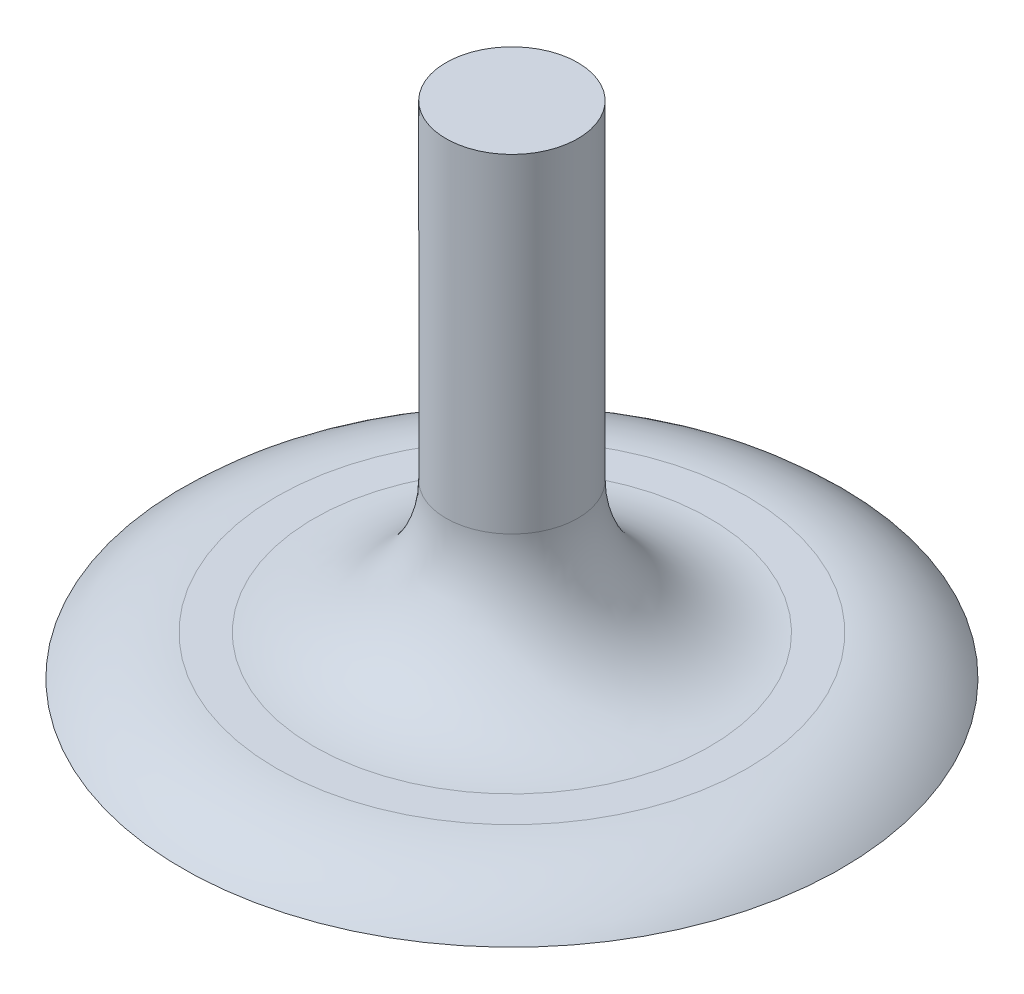
ISO-10303-21;
HEADER;
FILE_DESCRIPTION(('STEP AP214'),'2;1');
FILE_NAME('part.step','',(''),(''),'','','');
FILE_SCHEMA(('AUTOMOTIVE_DESIGN { 1 0 10303 214 1 1 1 1 }'));
ENDSEC;
DATA;
#1=APPLICATION_CONTEXT('core data for automotive mechanical design processes');
#2=APPLICATION_PROTOCOL_DEFINITION('international standard','automotive_design',2000,#1);
#3=PRODUCT_CONTEXT('',#1,'mechanical');
#4=PRODUCT('Part','Part','',(#3));
#5=PRODUCT_RELATED_PRODUCT_CATEGORY('part','',(#4));
#6=PRODUCT_DEFINITION_FORMATION('','',#4);
#7=PRODUCT_DEFINITION_CONTEXT('part definition',#1,'design');
#8=PRODUCT_DEFINITION('design','',#6,#7);
#9=PRODUCT_DEFINITION_SHAPE('','',#8);
#10=(LENGTH_UNIT() NAMED_UNIT(*) SI_UNIT(.MILLI.,.METRE.));
#11=(NAMED_UNIT(*) PLANE_ANGLE_UNIT() SI_UNIT($,.RADIAN.));
#12=(NAMED_UNIT(*) SI_UNIT($,.STERADIAN.) SOLID_ANGLE_UNIT());
#13=UNCERTAINTY_MEASURE_WITH_UNIT(LENGTH_MEASURE(1.E-05),#10,'distance_accuracy_value','');
#14=(GEOMETRIC_REPRESENTATION_CONTEXT(3) GLOBAL_UNCERTAINTY_ASSIGNED_CONTEXT((#13)) GLOBAL_UNIT_ASSIGNED_CONTEXT((#10,
#11,#12)) REPRESENTATION_CONTEXT('',''));
#15=CARTESIAN_POINT('',(0.,0.,0.));
#16=DIRECTION('',(0.,0.,1.));
#17=DIRECTION('',(1.,0.,0.));
#18=AXIS2_PLACEMENT_3D('',#15,#16,#17);
#19=CARTESIAN_POINT('',(0.,51.6594567321813,0.));
#20=DIRECTION('',(0.,1.,0.));
#21=DIRECTION('',(0.,0.,1.));
#22=AXIS2_PLACEMENT_3D('',#19,#20,#21);
#23=PLANE('',#22);
#24=CARTESIAN_POINT('',(0.,51.6594567321813,0.));
#25=DIRECTION('',(0.,-1.,0.));
#26=DIRECTION('',(0.,0.,-1.));
#27=AXIS2_PLACEMENT_3D('',#24,#25,#26);
#28=CIRCLE('',#27,5.);
#29=CARTESIAN_POINT('',(0.,51.6594567321813,-5.));
#30=VERTEX_POINT('',#29);
#31=EDGE_CURVE('E89',#30,#30,#28,.T.);
#32=ORIENTED_EDGE('',*,*,#31,.F.);
#33=EDGE_LOOP('',(#32));
#34=FACE_BOUND('',#33,.T.);
#35=ADVANCED_FACE('F35',(#34),#23,.T.);
#36=CARTESIAN_POINT('',(0.,0.,0.));
#37=DIRECTION('',(0.,-1.,0.));
#38=DIRECTION('',(0.,0.,-1.));
#39=AXIS2_PLACEMENT_3D('',#36,#37,#38);
#40=CYLINDRICAL_SURFACE('',#39,5.);
#41=CARTESIAN_POINT('',(0.,26.7225346025478,0.));
#42=DIRECTION('',(0.,1.,0.));
#43=DIRECTION('',(0.,0.,1.));
#44=AXIS2_PLACEMENT_3D('',#41,#42,#43);
#45=CIRCLE('',#44,5.);
#46=CARTESIAN_POINT('',(0.,26.7225346025478,5.));
#47=VERTEX_POINT('',#46);
#48=EDGE_CURVE('E42',#47,#47,#45,.T.);
#49=ORIENTED_EDGE('',*,*,#48,.T.);
#50=EDGE_LOOP('',(#49));
#51=FACE_BOUND('',#50,.T.);
#52=ORIENTED_EDGE('',*,*,#31,.T.);
#53=EDGE_LOOP('',(#52));
#54=FACE_BOUND('',#53,.T.);
#55=ADVANCED_FACE('F63',(#51,#54),#40,.T.);
#56=CARTESIAN_POINT('',(0.,16.7225346025478,-5.));
#57=DIRECTION('',(0.,1.,0.));
#58=DIRECTION('',(0.,0.,1.));
#59=AXIS2_PLACEMENT_3D('',#56,#57,#58);
#60=PLANE('',#59);
#61=CARTESIAN_POINT('',(0.,16.7225346025478,0.));
#62=DIRECTION('',(0.,1.,0.));
#63=DIRECTION('',(0.,0.,1.));
#64=AXIS2_PLACEMENT_3D('',#61,#62,#63);
#65=CIRCLE('',#64,17.8585715714571);
#66=CARTESIAN_POINT('',(0.,16.7225346025478,17.8585715714571));
#67=VERTEX_POINT('',#66);
#68=EDGE_CURVE('E11',#67,#67,#65,.T.);
#69=ORIENTED_EDGE('',*,*,#68,.T.);
#70=EDGE_LOOP('',(#69));
#71=FACE_BOUND('',#70,.T.);
#72=CARTESIAN_POINT('',(0.,16.7225346025478,0.));
#73=DIRECTION('',(0.,1.,0.));
#74=DIRECTION('',(0.,0.,1.));
#75=AXIS2_PLACEMENT_3D('',#72,#73,#74);
#76=CIRCLE('',#75,15.);
#77=CARTESIAN_POINT('',(0.,16.7225346025478,15.));
#78=VERTEX_POINT('',#77);
#79=EDGE_CURVE('E84',#78,#78,#76,.F.);
#80=ORIENTED_EDGE('',*,*,#79,.T.);
#81=EDGE_LOOP('',(#80));
#82=FACE_BOUND('',#81,.T.);
#83=ADVANCED_FACE('F58',(#71,#82),#60,.T.);
#84=CARTESIAN_POINT('',(0.,13.7225346025478,-25.));
#85=DIRECTION('',(0.,-1.,0.));
#86=DIRECTION('',(0.,0.,-1.));
#87=AXIS2_PLACEMENT_3D('',#84,#85,#86);
#88=PLANE('',#87);
#89=CARTESIAN_POINT('',(0.,13.7225346025478,0.));
#90=DIRECTION('',(0.,-1.,0.));
#91=DIRECTION('',(0.,0.,-1.));
#92=AXIS2_PLACEMENT_3D('',#89,#90,#91);
#93=CIRCLE('',#92,16.8743420870379);
#94=CARTESIAN_POINT('',(0.,13.7225346025478,-16.8743420870379));
#95=VERTEX_POINT('',#94);
#96=EDGE_CURVE('E86',#95,#95,#93,.F.);
#97=ORIENTED_EDGE('',*,*,#96,.T.);
#98=EDGE_LOOP('',(#97));
#99=FACE_BOUND('',#98,.T.);
#100=CARTESIAN_POINT('',(0.,13.7225346025478,0.));
#101=DIRECTION('',(0.,-1.,0.));
#102=DIRECTION('',(0.,0.,-1.));
#103=AXIS2_PLACEMENT_3D('',#100,#101,#102);
#104=CIRCLE('',#103,25.);
#105=CARTESIAN_POINT('',(0.,13.7225346025478,-25.));
#106=VERTEX_POINT('',#105);
#107=EDGE_CURVE('E94',#106,#106,#104,.T.);
#108=ORIENTED_EDGE('',*,*,#107,.T.);
#109=EDGE_LOOP('',(#108));
#110=FACE_BOUND('',#109,.T.);
#111=ADVANCED_FACE('F48',(#99,#110),#88,.T.);
#112=CARTESIAN_POINT('',(0.,0.,0.));
#113=DIRECTION('',(0.,1.,0.));
#114=DIRECTION('',(0.,0.,1.));
#115=AXIS2_PLACEMENT_3D('',#112,#113,#114);
#116=CONICAL_SURFACE('',#115,0.,0.436332312998583);
#117=CARTESIAN_POINT('',(0.,10.7225346025478,0.));
#118=DIRECTION('',(0.,-1.,0.));
#119=DIRECTION('',(0.,0.,-1.));
#120=AXIS2_PLACEMENT_3D('',#117,#118,#119);
#121=CIRCLE('',#120,5.00000000000001);
#122=CARTESIAN_POINT('',(0.,10.7225346025478,-5.00000000000001));
#123=VERTEX_POINT('',#122);
#124=EDGE_CURVE('E97',#123,#123,#121,.T.);
#125=ORIENTED_EDGE('',*,*,#124,.T.);
#126=EDGE_LOOP('',(#125));
#127=FACE_BOUND('',#126,.T.);
#128=CARTESIAN_POINT('',(0.,0.,0.));
#129=VERTEX_POINT('',#128);
#130=VERTEX_LOOP('',#129);
#131=FACE_BOUND('',#130,.T.);
#132=ADVANCED_FACE('F45',(#127,#131),#116,.T.);
#133=CARTESIAN_POINT('',(0.,-11.2774653974522,0.));
#134=DIRECTION('',(0.,-1.,0.));
#135=DIRECTION('',(0.,0.,-1.));
#136=AXIS2_PLACEMENT_3D('',#133,#134,#135);
#137=DEGENERATE_TOROIDAL_SURFACE('',#136,16.8743420870379,25.,.T.);
#138=ORIENTED_EDGE('',*,*,#96,.F.);
#139=EDGE_LOOP('',(#138));
#140=FACE_BOUND('',#139,.T.);
#141=ORIENTED_EDGE('',*,*,#124,.F.);
#142=EDGE_LOOP('',(#141));
#143=FACE_BOUND('',#142,.T.);
#144=ADVANCED_FACE('F47',(#140,#143),#137,.F.);
#145=CARTESIAN_POINT('',(0.,26.7225346025478,0.));
#146=DIRECTION('',(0.,1.,0.));
#147=DIRECTION('',(0.,0.,1.));
#148=AXIS2_PLACEMENT_3D('',#145,#146,#147);
#149=TOROIDAL_SURFACE('',#148,15.,10.);
#150=ORIENTED_EDGE('',*,*,#48,.F.);
#151=EDGE_LOOP('',(#150));
#152=FACE_BOUND('',#151,.T.);
#153=ORIENTED_EDGE('',*,*,#79,.F.);
#154=EDGE_LOOP('',(#153));
#155=FACE_BOUND('',#154,.T.);
#156=ADVANCED_FACE('F55',(#152,#155),#149,.F.);
#157=CARTESIAN_POINT('',(0.,6.72253460254779,0.));
#158=DIRECTION('',(0.,-1.,0.));
#159=DIRECTION('',(0.,0.,-1.));
#160=AXIS2_PLACEMENT_3D('',#157,#158,#159);
#161=TOROIDAL_SURFACE('',#160,17.8585715714571,10.);
#162=ORIENTED_EDGE('',*,*,#68,.F.);
#163=EDGE_LOOP('',(#162));
#164=FACE_BOUND('',#163,.T.);
#165=ORIENTED_EDGE('',*,*,#107,.F.);
#166=EDGE_LOOP('',(#165));
#167=FACE_BOUND('',#166,.T.);
#168=ADVANCED_FACE('F37',(#164,#167),#161,.T.);
#169=CLOSED_SHELL('',(#35,#55,#83,#111,#132,#144,#156,#168));
#170=MANIFOLD_SOLID_BREP('B2',#169);
#171=ADVANCED_BREP_SHAPE_REPRESENTATION('',(#18,#170),#14);
#172=SHAPE_DEFINITION_REPRESENTATION(#9,#171);
ENDSEC;
END-ISO-10303-21;
